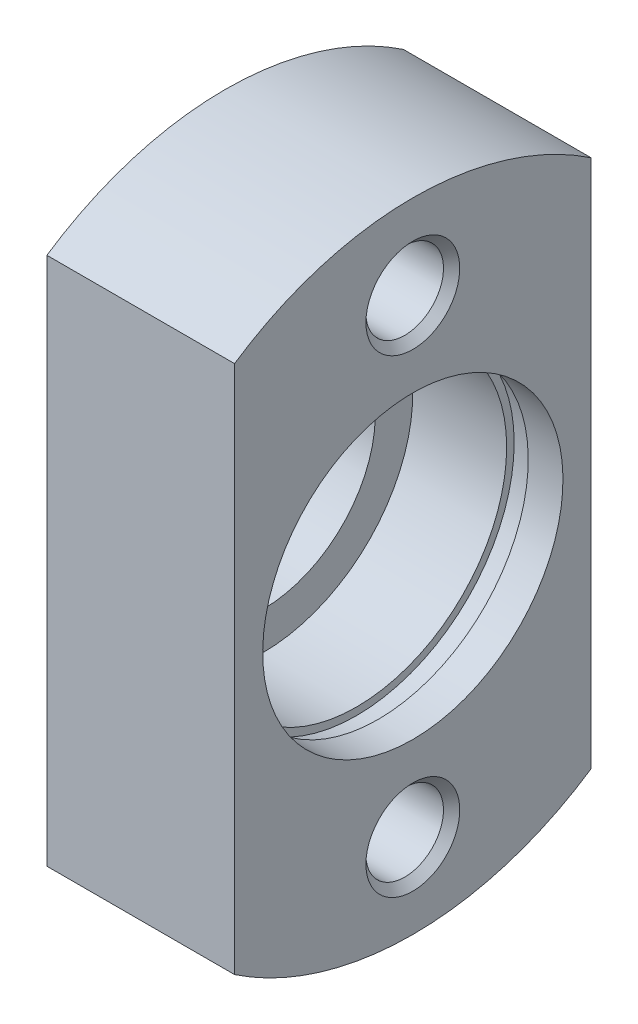
ISO-10303-21;
HEADER;
FILE_DESCRIPTION(('STEP AP214'),'2;1');
FILE_NAME('part.step','',(''),(''),'','','');
FILE_SCHEMA(('AUTOMOTIVE_DESIGN { 1 0 10303 214 1 1 1 1 }'));
ENDSEC;
DATA;
#1=APPLICATION_CONTEXT('core data for automotive mechanical design processes');
#2=APPLICATION_PROTOCOL_DEFINITION('international standard','automotive_design',2000,#1);
#3=PRODUCT_CONTEXT('',#1,'mechanical');
#4=PRODUCT('Part','Part','',(#3));
#5=PRODUCT_RELATED_PRODUCT_CATEGORY('part','',(#4));
#6=PRODUCT_DEFINITION_FORMATION('','',#4);
#7=PRODUCT_DEFINITION_CONTEXT('part definition',#1,'design');
#8=PRODUCT_DEFINITION('design','',#6,#7);
#9=PRODUCT_DEFINITION_SHAPE('','',#8);
#10=(LENGTH_UNIT() NAMED_UNIT(*) SI_UNIT(.MILLI.,.METRE.));
#11=(NAMED_UNIT(*) PLANE_ANGLE_UNIT() SI_UNIT($,.RADIAN.));
#12=(NAMED_UNIT(*) SI_UNIT($,.STERADIAN.) SOLID_ANGLE_UNIT());
#13=UNCERTAINTY_MEASURE_WITH_UNIT(LENGTH_MEASURE(1.E-05),#10,'distance_accuracy_value','');
#14=(GEOMETRIC_REPRESENTATION_CONTEXT(3) GLOBAL_UNCERTAINTY_ASSIGNED_CONTEXT((#13)) GLOBAL_UNIT_ASSIGNED_CONTEXT((#10,
#11,#12)) REPRESENTATION_CONTEXT('',''));
#15=CARTESIAN_POINT('',(0.,0.,0.));
#16=DIRECTION('',(0.,0.,1.));
#17=DIRECTION('',(1.,0.,0.));
#18=AXIS2_PLACEMENT_3D('',#15,#16,#17);
#19=CARTESIAN_POINT('',(5.,1.55431223447522E-12,0.));
#20=DIRECTION('',(1.,0.,0.));
#21=DIRECTION('',(0.,0.,-1.));
#22=AXIS2_PLACEMENT_3D('',#19,#20,#21);
#23=PLANE('',#22);
#24=CARTESIAN_POINT('',(5.,-12.5,0.));
#25=DIRECTION('',(-1.,0.,0.));
#26=DIRECTION('',(0.,0.,1.));
#27=AXIS2_PLACEMENT_3D('',#24,#25,#26);
#28=CIRCLE('',#27,2.5);
#29=CARTESIAN_POINT('',(5.,-12.5,2.5));
#30=VERTEX_POINT('',#29);
#31=EDGE_CURVE('E235',#30,#30,#28,.T.);
#32=ORIENTED_EDGE('',*,*,#31,.T.);
#33=EDGE_LOOP('',(#32));
#34=FACE_BOUND('',#33,.T.);
#35=CARTESIAN_POINT('',(5.,1.55431223447522E-12,0.));
#36=DIRECTION('',(1.,0.,0.));
#37=DIRECTION('',(0.,0.,-1.));
#38=AXIS2_PLACEMENT_3D('',#35,#36,#37);
#39=CIRCLE('',#38,17.0000000000015);
#40=CARTESIAN_POINT('',(5.,-14.097872179872,9.5));
#41=VERTEX_POINT('',#40);
#42=CARTESIAN_POINT('',(5.,-14.097872179872,-9.5));
#43=VERTEX_POINT('',#42);
#44=EDGE_CURVE('E105',#41,#43,#39,.T.);
#45=ORIENTED_EDGE('',*,*,#44,.T.);
#46=DIRECTION('',(0.,1.,0.));
#47=VECTOR('',#46,1.);
#48=CARTESIAN_POINT('',(5.,-14.097872179872,-9.5));
#49=LINE('',#48,#47);
#50=CARTESIAN_POINT('',(5.,14.097872179872,-9.5));
#51=VERTEX_POINT('',#50);
#52=EDGE_CURVE('E79',#43,#51,#49,.T.);
#53=ORIENTED_EDGE('',*,*,#52,.T.);
#54=CARTESIAN_POINT('',(5.,1.55431223447522E-12,0.));
#55=DIRECTION('',(1.,0.,0.));
#56=DIRECTION('',(0.,0.,-1.));
#57=AXIS2_PLACEMENT_3D('',#54,#55,#56);
#58=CIRCLE('',#57,16.999999999999);
#59=CARTESIAN_POINT('',(5.,14.097872179872,9.5));
#60=VERTEX_POINT('',#59);
#61=EDGE_CURVE('E55',#51,#60,#58,.T.);
#62=ORIENTED_EDGE('',*,*,#61,.T.);
#63=DIRECTION('',(0.,-1.,0.));
#64=VECTOR('',#63,1.);
#65=CARTESIAN_POINT('',(5.,14.097872179872,9.5));
#66=LINE('',#65,#64);
#67=EDGE_CURVE('E50',#60,#41,#66,.T.);
#68=ORIENTED_EDGE('',*,*,#67,.T.);
#69=EDGE_LOOP('',(#45,#53,#62,#68));
#70=FACE_BOUND('',#69,.T.);
#71=CARTESIAN_POINT('',(5.00000000000001,0.,0.));
#72=DIRECTION('',(-1.,0.,0.));
#73=DIRECTION('',(0.,-1.,0.));
#74=AXIS2_PLACEMENT_3D('',#71,#72,#73);
#75=CIRCLE('',#74,7.99999999999999);
#76=CARTESIAN_POINT('',(5.00000000000001,-7.99999999999999,0.));
#77=VERTEX_POINT('',#76);
#78=EDGE_CURVE('E119',#77,#77,#75,.T.);
#79=ORIENTED_EDGE('',*,*,#78,.T.);
#80=EDGE_LOOP('',(#79));
#81=FACE_BOUND('',#80,.T.);
#82=CARTESIAN_POINT('',(5.,12.5,0.));
#83=DIRECTION('',(-1.,0.,0.));
#84=DIRECTION('',(0.,0.,1.));
#85=AXIS2_PLACEMENT_3D('',#82,#83,#84);
#86=CIRCLE('',#85,2.5);
#87=CARTESIAN_POINT('',(5.,12.5,2.5));
#88=VERTEX_POINT('',#87);
#89=EDGE_CURVE('E224',#88,#88,#86,.T.);
#90=ORIENTED_EDGE('',*,*,#89,.T.);
#91=EDGE_LOOP('',(#90));
#92=FACE_BOUND('',#91,.T.);
#93=ADVANCED_FACE('F33',(#34,#70,#81,#92),#23,.T.);
#94=CARTESIAN_POINT('',(-5.,1.55431223447522E-12,0.));
#95=DIRECTION('',(1.,0.,0.));
#96=DIRECTION('',(0.,0.,-1.));
#97=AXIS2_PLACEMENT_3D('',#94,#95,#96);
#98=PLANE('',#97);
#99=CARTESIAN_POINT('',(-5.,-12.5,0.));
#100=DIRECTION('',(-1.,0.,0.));
#101=DIRECTION('',(0.,0.,1.));
#102=AXIS2_PLACEMENT_3D('',#99,#100,#101);
#103=CIRCLE('',#102,2.5);
#104=CARTESIAN_POINT('',(-5.,-12.5,2.5));
#105=VERTEX_POINT('',#104);
#106=EDGE_CURVE('E126',#105,#105,#103,.T.);
#107=ORIENTED_EDGE('',*,*,#106,.F.);
#108=EDGE_LOOP('',(#107));
#109=FACE_BOUND('',#108,.T.);
#110=CARTESIAN_POINT('',(-5.,1.55431223447522E-12,0.));
#111=DIRECTION('',(1.,0.,0.));
#112=DIRECTION('',(0.,0.,-1.));
#113=AXIS2_PLACEMENT_3D('',#110,#111,#112);
#114=CIRCLE('',#113,17.0000000000015);
#115=CARTESIAN_POINT('',(-5.,-14.097872179872,9.5));
#116=VERTEX_POINT('',#115);
#117=CARTESIAN_POINT('',(-5.,-14.097872179872,-9.5));
#118=VERTEX_POINT('',#117);
#119=EDGE_CURVE('E89',#116,#118,#114,.T.);
#120=ORIENTED_EDGE('',*,*,#119,.F.);
#121=DIRECTION('',(0.,-1.,0.));
#122=VECTOR('',#121,1.);
#123=CARTESIAN_POINT('',(-5.,14.097872179872,9.5));
#124=LINE('',#123,#122);
#125=CARTESIAN_POINT('',(-5.,14.097872179872,9.5));
#126=VERTEX_POINT('',#125);
#127=EDGE_CURVE('E103',#126,#116,#124,.T.);
#128=ORIENTED_EDGE('',*,*,#127,.F.);
#129=CARTESIAN_POINT('',(-5.,1.55431223447522E-12,0.));
#130=DIRECTION('',(1.,0.,0.));
#131=DIRECTION('',(0.,0.,-1.));
#132=AXIS2_PLACEMENT_3D('',#129,#130,#131);
#133=CIRCLE('',#132,16.999999999999);
#134=CARTESIAN_POINT('',(-5.,14.097872179872,-9.5));
#135=VERTEX_POINT('',#134);
#136=EDGE_CURVE('E92',#135,#126,#133,.T.);
#137=ORIENTED_EDGE('',*,*,#136,.F.);
#138=DIRECTION('',(0.,1.,0.));
#139=VECTOR('',#138,1.);
#140=CARTESIAN_POINT('',(-5.,-14.097872179872,-9.5));
#141=LINE('',#140,#139);
#142=EDGE_CURVE('E78',#118,#135,#141,.T.);
#143=ORIENTED_EDGE('',*,*,#142,.F.);
#144=EDGE_LOOP('',(#120,#128,#137,#143));
#145=FACE_BOUND('',#144,.T.);
#146=CARTESIAN_POINT('',(-5.,0.,0.));
#147=DIRECTION('',(-1.,0.,0.));
#148=DIRECTION('',(0.,-1.,0.));
#149=AXIS2_PLACEMENT_3D('',#146,#147,#148);
#150=CIRCLE('',#149,6.);
#151=CARTESIAN_POINT('',(-4.99999999999999,-6.,0.));
#152=VERTEX_POINT('',#151);
#153=EDGE_CURVE('E95',#152,#152,#150,.T.);
#154=ORIENTED_EDGE('',*,*,#153,.F.);
#155=EDGE_LOOP('',(#154));
#156=FACE_BOUND('',#155,.T.);
#157=CARTESIAN_POINT('',(-5.,12.5,0.));
#158=DIRECTION('',(-1.,0.,0.));
#159=DIRECTION('',(0.,0.,1.));
#160=AXIS2_PLACEMENT_3D('',#157,#158,#159);
#161=CIRCLE('',#160,2.5);
#162=CARTESIAN_POINT('',(-5.,12.5,2.5));
#163=VERTEX_POINT('',#162);
#164=EDGE_CURVE('E232',#163,#163,#161,.T.);
#165=ORIENTED_EDGE('',*,*,#164,.F.);
#166=EDGE_LOOP('',(#165));
#167=FACE_BOUND('',#166,.T.);
#168=ADVANCED_FACE('F86',(#109,#145,#156,#167),#98,.F.);
#169=CARTESIAN_POINT('',(5.,0.,0.));
#170=DIRECTION('',(-1.,0.,0.));
#171=DIRECTION('',(0.,-1.,0.));
#172=AXIS2_PLACEMENT_3D('',#169,#170,#171);
#173=CYLINDRICAL_SURFACE('',#172,8.);
#174=CARTESIAN_POINT('',(-2.99999999999999,0.,0.));
#175=DIRECTION('',(-1.,0.,0.));
#176=DIRECTION('',(0.,-1.,0.));
#177=AXIS2_PLACEMENT_3D('',#174,#175,#176);
#178=CIRCLE('',#177,8.);
#179=CARTESIAN_POINT('',(-2.99999999999999,-8.,0.));
#180=VERTEX_POINT('',#179);
#181=EDGE_CURVE('E132',#180,#180,#178,.T.);
#182=ORIENTED_EDGE('',*,*,#181,.T.);
#183=EDGE_LOOP('',(#182));
#184=FACE_BOUND('',#183,.T.);
#185=CARTESIAN_POINT('',(2.00000000000003,0.,0.));
#186=DIRECTION('',(1.,0.,0.));
#187=DIRECTION('',(0.,1.,0.));
#188=AXIS2_PLACEMENT_3D('',#185,#186,#187);
#189=CIRCLE('',#188,8.);
#190=CARTESIAN_POINT('',(1.99999999999998,8.,0.));
#191=VERTEX_POINT('',#190);
#192=EDGE_CURVE('E37',#191,#191,#189,.T.);
#193=ORIENTED_EDGE('',*,*,#192,.T.);
#194=EDGE_LOOP('',(#193));
#195=FACE_BOUND('',#194,.T.);
#196=ADVANCED_FACE('F161',(#184,#195),#173,.F.);
#197=ORIENTED_EDGE('',*,*,#78,.F.);
#198=EDGE_LOOP('',(#197));
#199=FACE_BOUND('',#198,.T.);
#200=CARTESIAN_POINT('',(3.15000000000003,0.,0.));
#201=DIRECTION('',(-1.,0.,0.));
#202=DIRECTION('',(0.,-1.,0.));
#203=AXIS2_PLACEMENT_3D('',#200,#201,#202);
#204=CIRCLE('',#203,8.);
#205=CARTESIAN_POINT('',(3.15000000000008,-7.99999999999999,0.));
#206=VERTEX_POINT('',#205);
#207=EDGE_CURVE('E113',#206,#206,#204,.T.);
#208=ORIENTED_EDGE('',*,*,#207,.T.);
#209=EDGE_LOOP('',(#208));
#210=FACE_BOUND('',#209,.T.);
#211=ADVANCED_FACE('F171',(#199,#210),#173,.F.);
#212=CARTESIAN_POINT('',(5.,1.55431223447522E-12,0.));
#213=DIRECTION('',(-1.,0.,0.));
#214=DIRECTION('',(0.,0.,1.));
#215=AXIS2_PLACEMENT_3D('',#212,#213,#214);
#216=CYLINDRICAL_SURFACE('',#215,17.0000000000015);
#217=DIRECTION('',(-1.,0.,0.));
#218=VECTOR('',#217,1.);
#219=CARTESIAN_POINT('',(5.,-14.097872179872,9.5));
#220=LINE('',#219,#218);
#221=EDGE_CURVE('E94',#41,#116,#220,.T.);
#222=ORIENTED_EDGE('',*,*,#221,.T.);
#223=ORIENTED_EDGE('',*,*,#119,.T.);
#224=DIRECTION('',(-1.,0.,0.));
#225=VECTOR('',#224,1.);
#226=CARTESIAN_POINT('',(5.,-14.097872179872,-9.5));
#227=LINE('',#226,#225);
#228=EDGE_CURVE('E11',#43,#118,#227,.T.);
#229=ORIENTED_EDGE('',*,*,#228,.F.);
#230=ORIENTED_EDGE('',*,*,#44,.F.);
#231=EDGE_LOOP('',(#222,#223,#229,#230));
#232=FACE_BOUND('',#231,.T.);
#233=ADVANCED_FACE('F35',(#232),#216,.T.);
#234=CARTESIAN_POINT('',(5.,-14.097872179872,-9.5));
#235=DIRECTION('',(0.,0.,1.));
#236=DIRECTION('',(1.,0.,0.));
#237=AXIS2_PLACEMENT_3D('',#234,#235,#236);
#238=PLANE('',#237);
#239=ORIENTED_EDGE('',*,*,#228,.T.);
#240=ORIENTED_EDGE('',*,*,#142,.T.);
#241=DIRECTION('',(-1.,0.,0.));
#242=VECTOR('',#241,1.);
#243=CARTESIAN_POINT('',(5.,14.097872179872,-9.5));
#244=LINE('',#243,#242);
#245=EDGE_CURVE('E42',#51,#135,#244,.T.);
#246=ORIENTED_EDGE('',*,*,#245,.F.);
#247=ORIENTED_EDGE('',*,*,#52,.F.);
#248=EDGE_LOOP('',(#239,#240,#246,#247));
#249=FACE_BOUND('',#248,.T.);
#250=ADVANCED_FACE('F76',(#249),#238,.F.);
#251=CARTESIAN_POINT('',(5.,1.55431223447522E-12,0.));
#252=DIRECTION('',(-1.,0.,0.));
#253=DIRECTION('',(0.,0.,1.));
#254=AXIS2_PLACEMENT_3D('',#251,#252,#253);
#255=CYLINDRICAL_SURFACE('',#254,16.999999999999);
#256=ORIENTED_EDGE('',*,*,#245,.T.);
#257=ORIENTED_EDGE('',*,*,#136,.T.);
#258=DIRECTION('',(-1.,0.,0.));
#259=VECTOR('',#258,1.);
#260=CARTESIAN_POINT('',(5.,14.097872179872,9.5));
#261=LINE('',#260,#259);
#262=EDGE_CURVE('E111',#60,#126,#261,.T.);
#263=ORIENTED_EDGE('',*,*,#262,.F.);
#264=ORIENTED_EDGE('',*,*,#61,.F.);
#265=EDGE_LOOP('',(#256,#257,#263,#264));
#266=FACE_BOUND('',#265,.T.);
#267=ADVANCED_FACE('F151',(#266),#255,.T.);
#268=CARTESIAN_POINT('',(5.,14.097872179872,9.5));
#269=DIRECTION('',(0.,0.,-1.));
#270=DIRECTION('',(-1.,0.,0.));
#271=AXIS2_PLACEMENT_3D('',#268,#269,#270);
#272=PLANE('',#271);
#273=ORIENTED_EDGE('',*,*,#262,.T.);
#274=ORIENTED_EDGE('',*,*,#127,.T.);
#275=ORIENTED_EDGE('',*,*,#221,.F.);
#276=ORIENTED_EDGE('',*,*,#67,.F.);
#277=EDGE_LOOP('',(#273,#274,#275,#276));
#278=FACE_BOUND('',#277,.T.);
#279=ADVANCED_FACE('F142',(#278),#272,.F.);
#280=CARTESIAN_POINT('',(5.,0.,0.));
#281=DIRECTION('',(-1.,0.,0.));
#282=DIRECTION('',(0.,-1.,0.));
#283=AXIS2_PLACEMENT_3D('',#280,#281,#282);
#284=CYLINDRICAL_SURFACE('',#283,6.);
#285=ORIENTED_EDGE('',*,*,#153,.T.);
#286=EDGE_LOOP('',(#285));
#287=FACE_BOUND('',#286,.T.);
#288=CARTESIAN_POINT('',(-3.,0.,0.));
#289=DIRECTION('',(-1.,0.,0.));
#290=DIRECTION('',(0.,-1.,0.));
#291=AXIS2_PLACEMENT_3D('',#288,#289,#290);
#292=CIRCLE('',#291,6.);
#293=CARTESIAN_POINT('',(-2.99999999999999,-6.,0.));
#294=VERTEX_POINT('',#293);
#295=EDGE_CURVE('E98',#294,#294,#292,.T.);
#296=ORIENTED_EDGE('',*,*,#295,.F.);
#297=EDGE_LOOP('',(#296));
#298=FACE_BOUND('',#297,.T.);
#299=ADVANCED_FACE('F140',(#287,#298),#284,.F.);
#300=CARTESIAN_POINT('',(-3.,6.,0.));
#301=DIRECTION('',(1.,0.,0.));
#302=DIRECTION('',(0.,1.,0.));
#303=AXIS2_PLACEMENT_3D('',#300,#301,#302);
#304=PLANE('',#303);
#305=ORIENTED_EDGE('',*,*,#295,.T.);
#306=EDGE_LOOP('',(#305));
#307=FACE_BOUND('',#306,.T.);
#308=ORIENTED_EDGE('',*,*,#181,.F.);
#309=EDGE_LOOP('',(#308));
#310=FACE_BOUND('',#309,.T.);
#311=ADVANCED_FACE('F137',(#307,#310),#304,.T.);
#312=CARTESIAN_POINT('',(2.00000000000003,0.,0.));
#313=DIRECTION('',(1.,0.,0.));
#314=DIRECTION('',(0.,1.,0.));
#315=AXIS2_PLACEMENT_3D('',#312,#313,#314);
#316=PLANE('',#315);
#317=ORIENTED_EDGE('',*,*,#192,.F.);
#318=EDGE_LOOP('',(#317));
#319=FACE_BOUND('',#318,.T.);
#320=CARTESIAN_POINT('',(2.00000000000005,0.,0.));
#321=DIRECTION('',(-1.,0.,0.));
#322=DIRECTION('',(0.,-1.,0.));
#323=AXIS2_PLACEMENT_3D('',#320,#321,#322);
#324=CIRCLE('',#323,8.4);
#325=CARTESIAN_POINT('',(2.0000000000001,-8.4,0.));
#326=VERTEX_POINT('',#325);
#327=EDGE_CURVE('E115',#326,#326,#324,.T.);
#328=ORIENTED_EDGE('',*,*,#327,.F.);
#329=EDGE_LOOP('',(#328));
#330=FACE_BOUND('',#329,.T.);
#331=ADVANCED_FACE('F149',(#319,#330),#316,.T.);
#332=CARTESIAN_POINT('',(3.15,0.,0.));
#333=DIRECTION('',(-1.,0.,0.));
#334=DIRECTION('',(0.,-1.,0.));
#335=AXIS2_PLACEMENT_3D('',#332,#333,#334);
#336=CYLINDRICAL_SURFACE('',#335,8.4);
#337=ORIENTED_EDGE('',*,*,#327,.T.);
#338=EDGE_LOOP('',(#337));
#339=FACE_BOUND('',#338,.T.);
#340=CARTESIAN_POINT('',(3.15000000000005,0.,0.));
#341=DIRECTION('',(-1.,0.,0.));
#342=DIRECTION('',(0.,-1.,0.));
#343=AXIS2_PLACEMENT_3D('',#340,#341,#342);
#344=CIRCLE('',#343,8.39999999999999);
#345=CARTESIAN_POINT('',(3.1500000000001,-8.39999999999999,0.));
#346=VERTEX_POINT('',#345);
#347=EDGE_CURVE('E121',#346,#346,#344,.T.);
#348=ORIENTED_EDGE('',*,*,#347,.F.);
#349=EDGE_LOOP('',(#348));
#350=FACE_BOUND('',#349,.T.);
#351=ADVANCED_FACE('F185',(#339,#350),#336,.F.);
#352=CARTESIAN_POINT('',(3.14999999999997,8.4,0.));
#353=DIRECTION('',(-1.,0.,0.));
#354=DIRECTION('',(0.,-1.,0.));
#355=AXIS2_PLACEMENT_3D('',#352,#353,#354);
#356=PLANE('',#355);
#357=ORIENTED_EDGE('',*,*,#207,.F.);
#358=EDGE_LOOP('',(#357));
#359=FACE_BOUND('',#358,.T.);
#360=ORIENTED_EDGE('',*,*,#347,.T.);
#361=EDGE_LOOP('',(#360));
#362=FACE_BOUND('',#361,.T.);
#363=ADVANCED_FACE('F189',(#359,#362),#356,.T.);
#364=CARTESIAN_POINT('',(-4.567,-12.5,0.));
#365=DIRECTION('',(-1.,0.,0.));
#366=DIRECTION('',(0.,0.,1.));
#367=AXIS2_PLACEMENT_3D('',#364,#365,#366);
#368=CONICAL_SURFACE('',#367,2.067,0.785398163397446);
#369=ORIENTED_EDGE('',*,*,#106,.T.);
#370=EDGE_LOOP('',(#369));
#371=FACE_BOUND('',#370,.T.);
#372=CARTESIAN_POINT('',(-4.567,-12.5,0.));
#373=DIRECTION('',(-1.,0.,0.));
#374=DIRECTION('',(0.,0.,1.));
#375=AXIS2_PLACEMENT_3D('',#372,#373,#374);
#376=CIRCLE('',#375,2.067);
#377=CARTESIAN_POINT('',(-4.567,-12.5,2.067));
#378=VERTEX_POINT('',#377);
#379=EDGE_CURVE('E240',#378,#378,#376,.T.);
#380=ORIENTED_EDGE('',*,*,#379,.F.);
#381=EDGE_LOOP('',(#380));
#382=FACE_BOUND('',#381,.T.);
#383=ADVANCED_FACE('F192',(#371,#382),#368,.F.);
#384=CARTESIAN_POINT('',(5.,-12.5,0.));
#385=DIRECTION('',(-1.,0.,0.));
#386=DIRECTION('',(0.,0.,1.));
#387=AXIS2_PLACEMENT_3D('',#384,#385,#386);
#388=CYLINDRICAL_SURFACE('',#387,2.067);
#389=ORIENTED_EDGE('',*,*,#379,.T.);
#390=EDGE_LOOP('',(#389));
#391=FACE_BOUND('',#390,.T.);
#392=CARTESIAN_POINT('',(4.567,-12.5,0.));
#393=DIRECTION('',(-1.,0.,0.));
#394=DIRECTION('',(0.,0.,1.));
#395=AXIS2_PLACEMENT_3D('',#392,#393,#394);
#396=CIRCLE('',#395,2.067);
#397=CARTESIAN_POINT('',(4.567,-12.5,2.067));
#398=VERTEX_POINT('',#397);
#399=EDGE_CURVE('E237',#398,#398,#396,.T.);
#400=ORIENTED_EDGE('',*,*,#399,.F.);
#401=EDGE_LOOP('',(#400));
#402=FACE_BOUND('',#401,.T.);
#403=ADVANCED_FACE('F196',(#391,#402),#388,.F.);
#404=CARTESIAN_POINT('',(5.,-12.5,0.));
#405=DIRECTION('',(1.,0.,0.));
#406=DIRECTION('',(0.,0.,-1.));
#407=AXIS2_PLACEMENT_3D('',#404,#405,#406);
#408=CONICAL_SURFACE('',#407,2.5,0.785398163397447);
#409=ORIENTED_EDGE('',*,*,#399,.T.);
#410=EDGE_LOOP('',(#409));
#411=FACE_BOUND('',#410,.T.);
#412=ORIENTED_EDGE('',*,*,#31,.F.);
#413=EDGE_LOOP('',(#412));
#414=FACE_BOUND('',#413,.T.);
#415=ADVANCED_FACE('F200',(#411,#414),#408,.F.);
#416=CARTESIAN_POINT('',(-4.567,12.5,0.));
#417=DIRECTION('',(-1.,0.,0.));
#418=DIRECTION('',(0.,0.,1.));
#419=AXIS2_PLACEMENT_3D('',#416,#417,#418);
#420=CONICAL_SURFACE('',#419,2.067,0.785398163397446);
#421=ORIENTED_EDGE('',*,*,#164,.T.);
#422=EDGE_LOOP('',(#421));
#423=FACE_BOUND('',#422,.T.);
#424=CARTESIAN_POINT('',(-4.567,12.5,0.));
#425=DIRECTION('',(-1.,0.,0.));
#426=DIRECTION('',(0.,0.,1.));
#427=AXIS2_PLACEMENT_3D('',#424,#425,#426);
#428=CIRCLE('',#427,2.067);
#429=CARTESIAN_POINT('',(-4.567,12.5,2.067));
#430=VERTEX_POINT('',#429);
#431=EDGE_CURVE('E227',#430,#430,#428,.T.);
#432=ORIENTED_EDGE('',*,*,#431,.F.);
#433=EDGE_LOOP('',(#432));
#434=FACE_BOUND('',#433,.T.);
#435=ADVANCED_FACE('F204',(#423,#434),#420,.F.);
#436=CARTESIAN_POINT('',(5.,12.5,0.));
#437=DIRECTION('',(-1.,0.,0.));
#438=DIRECTION('',(0.,0.,1.));
#439=AXIS2_PLACEMENT_3D('',#436,#437,#438);
#440=CYLINDRICAL_SURFACE('',#439,2.067);
#441=ORIENTED_EDGE('',*,*,#431,.T.);
#442=EDGE_LOOP('',(#441));
#443=FACE_BOUND('',#442,.T.);
#444=CARTESIAN_POINT('',(4.567,12.5,0.));
#445=DIRECTION('',(-1.,0.,0.));
#446=DIRECTION('',(0.,0.,1.));
#447=AXIS2_PLACEMENT_3D('',#444,#445,#446);
#448=CIRCLE('',#447,2.067);
#449=CARTESIAN_POINT('',(4.567,12.5,2.067));
#450=VERTEX_POINT('',#449);
#451=EDGE_CURVE('E221',#450,#450,#448,.T.);
#452=ORIENTED_EDGE('',*,*,#451,.F.);
#453=EDGE_LOOP('',(#452));
#454=FACE_BOUND('',#453,.T.);
#455=ADVANCED_FACE('F208',(#443,#454),#440,.F.);
#456=CARTESIAN_POINT('',(5.,12.5,0.));
#457=DIRECTION('',(1.,0.,0.));
#458=DIRECTION('',(0.,0.,-1.));
#459=AXIS2_PLACEMENT_3D('',#456,#457,#458);
#460=CONICAL_SURFACE('',#459,2.5,0.785398163397447);
#461=ORIENTED_EDGE('',*,*,#451,.T.);
#462=EDGE_LOOP('',(#461));
#463=FACE_BOUND('',#462,.T.);
#464=ORIENTED_EDGE('',*,*,#89,.F.);
#465=EDGE_LOOP('',(#464));
#466=FACE_BOUND('',#465,.T.);
#467=ADVANCED_FACE('F212',(#463,#466),#460,.F.);
#468=CLOSED_SHELL('',(#93,#168,#196,#211,#233,#250,#267,#279,#299,#311,#331,#351,#363,#383,#403,
#415,#435,#455,#467));
#469=MANIFOLD_SOLID_BREP('B2',#468);
#470=ADVANCED_BREP_SHAPE_REPRESENTATION('',(#18,#469),#14);
#471=SHAPE_DEFINITION_REPRESENTATION(#9,#470);
ENDSEC;
END-ISO-10303-21;
